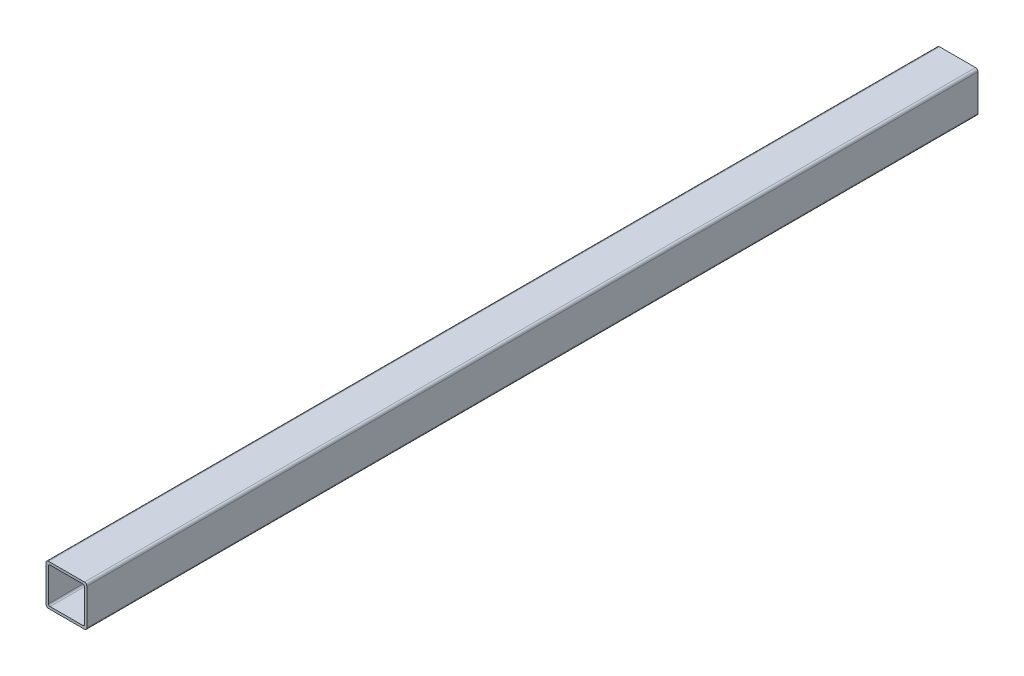
ISO-10303-21;
HEADER;
FILE_DESCRIPTION(('STEP AP214'),'2;1');
FILE_NAME('part.step','',(''),(''),'','','');
FILE_SCHEMA(('AUTOMOTIVE_DESIGN { 1 0 10303 214 1 1 1 1 }'));
ENDSEC;
DATA;
#1=APPLICATION_CONTEXT('core data for automotive mechanical design processes');
#2=APPLICATION_PROTOCOL_DEFINITION('international standard','automotive_design',2000,#1);
#3=PRODUCT_CONTEXT('',#1,'mechanical');
#4=PRODUCT('Part','Part','',(#3));
#5=PRODUCT_RELATED_PRODUCT_CATEGORY('part','',(#4));
#6=PRODUCT_DEFINITION_FORMATION('','',#4);
#7=PRODUCT_DEFINITION_CONTEXT('part definition',#1,'design');
#8=PRODUCT_DEFINITION('design','',#6,#7);
#9=PRODUCT_DEFINITION_SHAPE('','',#8);
#10=(LENGTH_UNIT() NAMED_UNIT(*) SI_UNIT(.MILLI.,.METRE.));
#11=(NAMED_UNIT(*) PLANE_ANGLE_UNIT() SI_UNIT($,.RADIAN.));
#12=(NAMED_UNIT(*) SI_UNIT($,.STERADIAN.) SOLID_ANGLE_UNIT());
#13=UNCERTAINTY_MEASURE_WITH_UNIT(LENGTH_MEASURE(1.E-05),#10,'distance_accuracy_value','');
#14=(GEOMETRIC_REPRESENTATION_CONTEXT(3) GLOBAL_UNCERTAINTY_ASSIGNED_CONTEXT((#13)) GLOBAL_UNIT_ASSIGNED_CONTEXT((#10,
#11,#12)) REPRESENTATION_CONTEXT('',''));
#15=CARTESIAN_POINT('',(0.,0.,0.));
#16=DIRECTION('',(0.,0.,1.));
#17=DIRECTION('',(1.,0.,0.));
#18=AXIS2_PLACEMENT_3D('',#15,#16,#17);
#19=CARTESIAN_POINT('',(-22.,-25.,-1160.71067811867));
#20=DIRECTION('',(0.,-1.,0.));
#21=DIRECTION('',(0.,0.,-1.));
#22=AXIS2_PLACEMENT_3D('',#19,#20,#21);
#23=PLANE('',#22);
#24=DIRECTION('',(-1.,0.,0.));
#25=VECTOR('',#24,1.);
#26=CARTESIAN_POINT('',(-22.,-25.,-1090.00000000001));
#27=LINE('',#26,#25);
#28=CARTESIAN_POINT('',(22.,-25.,-1090.00000000001));
#29=VERTEX_POINT('',#28);
#30=CARTESIAN_POINT('',(-22.,-25.,-1090.00000000001));
#31=VERTEX_POINT('',#30);
#32=EDGE_CURVE('E11',#29,#31,#27,.T.);
#33=ORIENTED_EDGE('',*,*,#32,.F.);
#34=DIRECTION('',(0.,0.,1.));
#35=VECTOR('',#34,1.);
#36=CARTESIAN_POINT('',(22.,-25.,-1160.71067811867));
#37=LINE('',#36,#35);
#38=CARTESIAN_POINT('',(22.,-25.,0.));
#39=VERTEX_POINT('',#38);
#40=EDGE_CURVE('E266',#29,#39,#37,.T.);
#41=ORIENTED_EDGE('',*,*,#40,.T.);
#42=DIRECTION('',(1.,0.,0.));
#43=VECTOR('',#42,1.);
#44=CARTESIAN_POINT('',(-22.,-25.,0.));
#45=LINE('',#44,#43);
#46=CARTESIAN_POINT('',(-22.,-25.,0.));
#47=VERTEX_POINT('',#46);
#48=EDGE_CURVE('E219',#47,#39,#45,.T.);
#49=ORIENTED_EDGE('',*,*,#48,.F.);
#50=DIRECTION('',(0.,0.,1.));
#51=VECTOR('',#50,1.);
#52=CARTESIAN_POINT('',(-22.,-25.,-1160.71067811867));
#53=LINE('',#52,#51);
#54=EDGE_CURVE('E247',#31,#47,#53,.T.);
#55=ORIENTED_EDGE('',*,*,#54,.F.);
#56=EDGE_LOOP('',(#33,#41,#49,#55));
#57=FACE_BOUND('',#56,.T.);
#58=ADVANCED_FACE('F36',(#57),#23,.T.);
#59=CARTESIAN_POINT('',(22.,-22.,-1160.71067811867));
#60=DIRECTION('',(0.,0.,1.));
#61=DIRECTION('',(1.,0.,0.));
#62=AXIS2_PLACEMENT_3D('',#59,#60,#61);
#63=CYLINDRICAL_SURFACE('',#62,3.);
#64=CARTESIAN_POINT('',(22.,-22.,-1090.00000000001));
#65=DIRECTION('',(0.,0.,1.));
#66=DIRECTION('',(1.,0.,0.));
#67=AXIS2_PLACEMENT_3D('',#64,#65,#66);
#68=CIRCLE('',#67,3.);
#69=CARTESIAN_POINT('',(25.,-22.,-1090.00000000001));
#70=VERTEX_POINT('',#69);
#71=EDGE_CURVE('E350',#70,#29,#68,.F.);
#72=ORIENTED_EDGE('',*,*,#71,.F.);
#73=DIRECTION('',(0.,0.,1.));
#74=VECTOR('',#73,1.);
#75=CARTESIAN_POINT('',(25.,-22.,-1160.71067811867));
#76=LINE('',#75,#74);
#77=CARTESIAN_POINT('',(25.,-22.,0.));
#78=VERTEX_POINT('',#77);
#79=EDGE_CURVE('E263',#70,#78,#76,.T.);
#80=ORIENTED_EDGE('',*,*,#79,.T.);
#81=CARTESIAN_POINT('',(22.,-22.,0.));
#82=DIRECTION('',(0.,0.,1.));
#83=DIRECTION('',(1.,0.,0.));
#84=AXIS2_PLACEMENT_3D('',#81,#82,#83);
#85=CIRCLE('',#84,3.);
#86=EDGE_CURVE('E223',#39,#78,#85,.T.);
#87=ORIENTED_EDGE('',*,*,#86,.F.);
#88=ORIENTED_EDGE('',*,*,#40,.F.);
#89=EDGE_LOOP('',(#72,#80,#87,#88));
#90=FACE_BOUND('',#89,.T.);
#91=ADVANCED_FACE('F379',(#90),#63,.T.);
#92=CARTESIAN_POINT('',(25.,22.,-1160.71067811867));
#93=DIRECTION('',(1.,0.,0.));
#94=DIRECTION('',(0.,0.,-1.));
#95=AXIS2_PLACEMENT_3D('',#92,#93,#94);
#96=PLANE('',#95);
#97=DIRECTION('',(0.,-1.,0.));
#98=VECTOR('',#97,1.);
#99=CARTESIAN_POINT('',(25.,22.,-1090.00000000001));
#100=LINE('',#99,#98);
#101=CARTESIAN_POINT('',(25.,22.,-1090.00000000001));
#102=VERTEX_POINT('',#101);
#103=EDGE_CURVE('E353',#102,#70,#100,.T.);
#104=ORIENTED_EDGE('',*,*,#103,.F.);
#105=DIRECTION('',(0.,0.,1.));
#106=VECTOR('',#105,1.);
#107=CARTESIAN_POINT('',(25.,22.,-1160.71067811867));
#108=LINE('',#107,#106);
#109=CARTESIAN_POINT('',(25.,22.,0.));
#110=VERTEX_POINT('',#109);
#111=EDGE_CURVE('E260',#102,#110,#108,.T.);
#112=ORIENTED_EDGE('',*,*,#111,.T.);
#113=DIRECTION('',(0.,1.,0.));
#114=VECTOR('',#113,1.);
#115=CARTESIAN_POINT('',(25.,22.,0.));
#116=LINE('',#115,#114);
#117=EDGE_CURVE('E227',#78,#110,#116,.T.);
#118=ORIENTED_EDGE('',*,*,#117,.F.);
#119=ORIENTED_EDGE('',*,*,#79,.F.);
#120=EDGE_LOOP('',(#104,#112,#118,#119));
#121=FACE_BOUND('',#120,.T.);
#122=ADVANCED_FACE('F376',(#121),#96,.T.);
#123=CARTESIAN_POINT('',(22.,22.,-1160.71067811867));
#124=DIRECTION('',(0.,0.,1.));
#125=DIRECTION('',(1.,0.,0.));
#126=AXIS2_PLACEMENT_3D('',#123,#124,#125);
#127=CYLINDRICAL_SURFACE('',#126,3.00000000000001);
#128=CARTESIAN_POINT('',(22.,22.,-1090.00000000001));
#129=DIRECTION('',(0.,0.,1.));
#130=DIRECTION('',(1.,0.,0.));
#131=AXIS2_PLACEMENT_3D('',#128,#129,#130);
#132=CIRCLE('',#131,3.00000000000001);
#133=CARTESIAN_POINT('',(22.,25.,-1090.00000000001));
#134=VERTEX_POINT('',#133);
#135=EDGE_CURVE('E356',#134,#102,#132,.F.);
#136=ORIENTED_EDGE('',*,*,#135,.F.);
#137=DIRECTION('',(0.,0.,1.));
#138=VECTOR('',#137,1.);
#139=CARTESIAN_POINT('',(22.,25.,-1160.71067811867));
#140=LINE('',#139,#138);
#141=CARTESIAN_POINT('',(22.,25.,0.));
#142=VERTEX_POINT('',#141);
#143=EDGE_CURVE('E257',#134,#142,#140,.T.);
#144=ORIENTED_EDGE('',*,*,#143,.T.);
#145=CARTESIAN_POINT('',(22.,22.,0.));
#146=DIRECTION('',(0.,0.,1.));
#147=DIRECTION('',(-1.,0.,0.));
#148=AXIS2_PLACEMENT_3D('',#145,#146,#147);
#149=CIRCLE('',#148,3.00000000000001);
#150=EDGE_CURVE('E231',#110,#142,#149,.T.);
#151=ORIENTED_EDGE('',*,*,#150,.F.);
#152=ORIENTED_EDGE('',*,*,#111,.F.);
#153=EDGE_LOOP('',(#136,#144,#151,#152));
#154=FACE_BOUND('',#153,.T.);
#155=ADVANCED_FACE('F369',(#154),#127,.T.);
#156=CARTESIAN_POINT('',(-22.,25.,-1160.71067811867));
#157=DIRECTION('',(0.,1.,0.));
#158=DIRECTION('',(-1.,0.,0.));
#159=AXIS2_PLACEMENT_3D('',#156,#157,#158);
#160=PLANE('',#159);
#161=DIRECTION('',(1.,0.,0.));
#162=VECTOR('',#161,1.);
#163=CARTESIAN_POINT('',(-22.,25.,-1090.00000000001));
#164=LINE('',#163,#162);
#165=CARTESIAN_POINT('',(-22.,25.,-1090.00000000001));
#166=VERTEX_POINT('',#165);
#167=EDGE_CURVE('E298',#166,#134,#164,.T.);
#168=ORIENTED_EDGE('',*,*,#167,.F.);
#169=DIRECTION('',(0.,0.,1.));
#170=VECTOR('',#169,1.);
#171=CARTESIAN_POINT('',(-22.,25.,-1160.71067811867));
#172=LINE('',#171,#170);
#173=CARTESIAN_POINT('',(-22.,25.,0.));
#174=VERTEX_POINT('',#173);
#175=EDGE_CURVE('E254',#166,#174,#172,.T.);
#176=ORIENTED_EDGE('',*,*,#175,.T.);
#177=DIRECTION('',(-1.,0.,0.));
#178=VECTOR('',#177,1.);
#179=CARTESIAN_POINT('',(-22.,25.,0.));
#180=LINE('',#179,#178);
#181=EDGE_CURVE('E235',#142,#174,#180,.T.);
#182=ORIENTED_EDGE('',*,*,#181,.F.);
#183=ORIENTED_EDGE('',*,*,#143,.F.);
#184=EDGE_LOOP('',(#168,#176,#182,#183));
#185=FACE_BOUND('',#184,.T.);
#186=ADVANCED_FACE('F372',(#185),#160,.T.);
#187=CARTESIAN_POINT('',(-22.,22.,-1160.71067811867));
#188=DIRECTION('',(0.,0.,1.));
#189=DIRECTION('',(1.,0.,0.));
#190=AXIS2_PLACEMENT_3D('',#187,#188,#189);
#191=CYLINDRICAL_SURFACE('',#190,3.);
#192=CARTESIAN_POINT('',(-22.,22.,-1090.00000000001));
#193=DIRECTION('',(0.,0.,1.));
#194=DIRECTION('',(1.,0.,0.));
#195=AXIS2_PLACEMENT_3D('',#192,#193,#194);
#196=CIRCLE('',#195,3.);
#197=CARTESIAN_POINT('',(-25.,22.,-1090.00000000001));
#198=VERTEX_POINT('',#197);
#199=EDGE_CURVE('E291',#198,#166,#196,.F.);
#200=ORIENTED_EDGE('',*,*,#199,.F.);
#201=DIRECTION('',(0.,0.,1.));
#202=VECTOR('',#201,1.);
#203=CARTESIAN_POINT('',(-25.,22.,-1160.71067811867));
#204=LINE('',#203,#202);
#205=CARTESIAN_POINT('',(-25.,22.,0.));
#206=VERTEX_POINT('',#205);
#207=EDGE_CURVE('E251',#198,#206,#204,.T.);
#208=ORIENTED_EDGE('',*,*,#207,.T.);
#209=CARTESIAN_POINT('',(-22.,22.,0.));
#210=DIRECTION('',(0.,0.,1.));
#211=DIRECTION('',(1.,0.,0.));
#212=AXIS2_PLACEMENT_3D('',#209,#210,#211);
#213=CIRCLE('',#212,3.);
#214=EDGE_CURVE('E239',#174,#206,#213,.T.);
#215=ORIENTED_EDGE('',*,*,#214,.F.);
#216=ORIENTED_EDGE('',*,*,#175,.F.);
#217=EDGE_LOOP('',(#200,#208,#215,#216));
#218=FACE_BOUND('',#217,.T.);
#219=ADVANCED_FACE('F392',(#218),#191,.T.);
#220=CARTESIAN_POINT('',(-25.,22.,-1160.71067811867));
#221=DIRECTION('',(-1.,0.,0.));
#222=DIRECTION('',(0.,0.,1.));
#223=AXIS2_PLACEMENT_3D('',#220,#221,#222);
#224=PLANE('',#223);
#225=DIRECTION('',(0.,1.,0.));
#226=VECTOR('',#225,1.);
#227=CARTESIAN_POINT('',(-25.,22.,-1090.00000000001));
#228=LINE('',#227,#226);
#229=CARTESIAN_POINT('',(-25.,-22.,-1090.00000000001));
#230=VERTEX_POINT('',#229);
#231=EDGE_CURVE('E287',#230,#198,#228,.T.);
#232=ORIENTED_EDGE('',*,*,#231,.F.);
#233=DIRECTION('',(0.,0.,1.));
#234=VECTOR('',#233,1.);
#235=CARTESIAN_POINT('',(-25.,-22.,-1160.71067811867));
#236=LINE('',#235,#234);
#237=CARTESIAN_POINT('',(-25.,-22.,0.));
#238=VERTEX_POINT('',#237);
#239=EDGE_CURVE('E248',#230,#238,#236,.T.);
#240=ORIENTED_EDGE('',*,*,#239,.T.);
#241=DIRECTION('',(0.,-1.,0.));
#242=VECTOR('',#241,1.);
#243=CARTESIAN_POINT('',(-25.,22.,0.));
#244=LINE('',#243,#242);
#245=EDGE_CURVE('E243',#206,#238,#244,.T.);
#246=ORIENTED_EDGE('',*,*,#245,.F.);
#247=ORIENTED_EDGE('',*,*,#207,.F.);
#248=EDGE_LOOP('',(#232,#240,#246,#247));
#249=FACE_BOUND('',#248,.T.);
#250=ADVANCED_FACE('F286',(#249),#224,.T.);
#251=CARTESIAN_POINT('',(-22.,-22.,-1160.71067811867));
#252=DIRECTION('',(0.,0.,1.));
#253=DIRECTION('',(1.,0.,0.));
#254=AXIS2_PLACEMENT_3D('',#251,#252,#253);
#255=CYLINDRICAL_SURFACE('',#254,3.);
#256=CARTESIAN_POINT('',(-22.,-22.,-1090.00000000001));
#257=DIRECTION('',(0.,0.,1.));
#258=DIRECTION('',(1.,0.,0.));
#259=AXIS2_PLACEMENT_3D('',#256,#257,#258);
#260=CIRCLE('',#259,3.);
#261=EDGE_CURVE('E276',#31,#230,#260,.F.);
#262=ORIENTED_EDGE('',*,*,#261,.F.);
#263=ORIENTED_EDGE('',*,*,#54,.T.);
#264=CARTESIAN_POINT('',(-22.,-22.,0.));
#265=DIRECTION('',(0.,0.,1.));
#266=DIRECTION('',(1.,0.,0.));
#267=AXIS2_PLACEMENT_3D('',#264,#265,#266);
#268=CIRCLE('',#267,3.);
#269=EDGE_CURVE('E199',#238,#47,#268,.T.);
#270=ORIENTED_EDGE('',*,*,#269,.F.);
#271=ORIENTED_EDGE('',*,*,#239,.F.);
#272=EDGE_LOOP('',(#262,#263,#270,#271));
#273=FACE_BOUND('',#272,.T.);
#274=ADVANCED_FACE('F38',(#273),#255,.T.);
#275=CARTESIAN_POINT('',(-22.,-22.,0.));
#276=DIRECTION('',(0.,0.,1.));
#277=DIRECTION('',(1.,0.,0.));
#278=AXIS2_PLACEMENT_3D('',#275,#276,#277);
#279=PLANE('',#278);
#280=CARTESIAN_POINT('',(-20.,-20.,0.));
#281=DIRECTION('',(0.,0.,1.));
#282=DIRECTION('',(1.,0.,0.));
#283=AXIS2_PLACEMENT_3D('',#280,#281,#282);
#284=CIRCLE('',#283,2.);
#285=CARTESIAN_POINT('',(-22.,-20.,0.));
#286=VERTEX_POINT('',#285);
#287=CARTESIAN_POINT('',(-20.,-22.,0.));
#288=VERTEX_POINT('',#287);
#289=EDGE_CURVE('E166',#286,#288,#284,.T.);
#290=ORIENTED_EDGE('',*,*,#289,.F.);
#291=DIRECTION('',(0.,-1.,0.));
#292=VECTOR('',#291,1.);
#293=CARTESIAN_POINT('',(-22.,20.,0.));
#294=LINE('',#293,#292);
#295=CARTESIAN_POINT('',(-22.,20.,0.));
#296=VERTEX_POINT('',#295);
#297=EDGE_CURVE('E192',#296,#286,#294,.T.);
#298=ORIENTED_EDGE('',*,*,#297,.F.);
#299=CARTESIAN_POINT('',(-20.,20.,0.));
#300=DIRECTION('',(0.,0.,1.));
#301=DIRECTION('',(1.,0.,0.));
#302=AXIS2_PLACEMENT_3D('',#299,#300,#301);
#303=CIRCLE('',#302,2.);
#304=CARTESIAN_POINT('',(-20.,22.,0.));
#305=VERTEX_POINT('',#304);
#306=EDGE_CURVE('E188',#305,#296,#303,.T.);
#307=ORIENTED_EDGE('',*,*,#306,.F.);
#308=DIRECTION('',(-1.,0.,0.));
#309=VECTOR('',#308,1.);
#310=CARTESIAN_POINT('',(-20.,22.,0.));
#311=LINE('',#310,#309);
#312=CARTESIAN_POINT('',(20.,22.,0.));
#313=VERTEX_POINT('',#312);
#314=EDGE_CURVE('E184',#313,#305,#311,.T.);
#315=ORIENTED_EDGE('',*,*,#314,.F.);
#316=CARTESIAN_POINT('',(20.,20.,0.));
#317=DIRECTION('',(0.,0.,1.));
#318=DIRECTION('',(-1.,0.,0.));
#319=AXIS2_PLACEMENT_3D('',#316,#317,#318);
#320=CIRCLE('',#319,2.);
#321=CARTESIAN_POINT('',(22.,20.,0.));
#322=VERTEX_POINT('',#321);
#323=EDGE_CURVE('E177',#322,#313,#320,.T.);
#324=ORIENTED_EDGE('',*,*,#323,.F.);
#325=DIRECTION('',(0.,1.,0.));
#326=VECTOR('',#325,1.);
#327=CARTESIAN_POINT('',(22.,20.,0.));
#328=LINE('',#327,#326);
#329=CARTESIAN_POINT('',(22.,-20.,0.));
#330=VERTEX_POINT('',#329);
#331=EDGE_CURVE('E172',#330,#322,#328,.T.);
#332=ORIENTED_EDGE('',*,*,#331,.F.);
#333=CARTESIAN_POINT('',(20.,-20.,0.));
#334=DIRECTION('',(0.,0.,1.));
#335=DIRECTION('',(1.,0.,0.));
#336=AXIS2_PLACEMENT_3D('',#333,#334,#335);
#337=CIRCLE('',#336,2.);
#338=CARTESIAN_POINT('',(20.,-22.,0.));
#339=VERTEX_POINT('',#338);
#340=EDGE_CURVE('E151',#339,#330,#337,.T.);
#341=ORIENTED_EDGE('',*,*,#340,.F.);
#342=DIRECTION('',(1.,0.,0.));
#343=VECTOR('',#342,1.);
#344=CARTESIAN_POINT('',(-20.,-22.,0.));
#345=LINE('',#344,#343);
#346=EDGE_CURVE('E159',#288,#339,#345,.T.);
#347=ORIENTED_EDGE('',*,*,#346,.F.);
#348=EDGE_LOOP('',(#290,#298,#307,#315,#324,#332,#341,#347));
#349=FACE_BOUND('',#348,.T.);
#350=ORIENTED_EDGE('',*,*,#269,.T.);
#351=ORIENTED_EDGE('',*,*,#48,.T.);
#352=ORIENTED_EDGE('',*,*,#86,.T.);
#353=ORIENTED_EDGE('',*,*,#117,.T.);
#354=ORIENTED_EDGE('',*,*,#150,.T.);
#355=ORIENTED_EDGE('',*,*,#181,.T.);
#356=ORIENTED_EDGE('',*,*,#214,.T.);
#357=ORIENTED_EDGE('',*,*,#245,.T.);
#358=EDGE_LOOP('',(#350,#351,#352,#353,#354,#355,#356,#357));
#359=FACE_BOUND('',#358,.T.);
#360=ADVANCED_FACE('F168',(#349,#359),#279,.T.);
#361=CARTESIAN_POINT('',(-20.,-22.,-1160.71067811867));
#362=DIRECTION('',(0.,-1.,0.));
#363=DIRECTION('',(0.,0.,-1.));
#364=AXIS2_PLACEMENT_3D('',#361,#362,#363);
#365=PLANE('',#364);
#366=DIRECTION('',(0.,0.,1.));
#367=VECTOR('',#366,1.);
#368=CARTESIAN_POINT('',(20.,-22.,-1160.71067811867));
#369=LINE('',#368,#367);
#370=CARTESIAN_POINT('',(20.,-22.,-1090.00000000001));
#371=VERTEX_POINT('',#370);
#372=EDGE_CURVE('E147',#371,#339,#369,.T.);
#373=ORIENTED_EDGE('',*,*,#372,.F.);
#374=DIRECTION('',(-1.,0.,0.));
#375=VECTOR('',#374,1.);
#376=CARTESIAN_POINT('',(-20.,-22.,-1090.00000000001));
#377=LINE('',#376,#375);
#378=CARTESIAN_POINT('',(-20.,-22.,-1090.00000000001));
#379=VERTEX_POINT('',#378);
#380=EDGE_CURVE('E40',#371,#379,#377,.T.);
#381=ORIENTED_EDGE('',*,*,#380,.T.);
#382=DIRECTION('',(0.,0.,1.));
#383=VECTOR('',#382,1.);
#384=CARTESIAN_POINT('',(-20.,-22.,-1160.71067811867));
#385=LINE('',#384,#383);
#386=EDGE_CURVE('E156',#379,#288,#385,.T.);
#387=ORIENTED_EDGE('',*,*,#386,.T.);
#388=ORIENTED_EDGE('',*,*,#346,.T.);
#389=EDGE_LOOP('',(#373,#381,#387,#388));
#390=FACE_BOUND('',#389,.T.);
#391=ADVANCED_FACE('F160',(#390),#365,.F.);
#392=CARTESIAN_POINT('',(20.,-20.,-1160.71067811867));
#393=DIRECTION('',(0.,0.,1.));
#394=DIRECTION('',(1.,0.,0.));
#395=AXIS2_PLACEMENT_3D('',#392,#393,#394);
#396=CYLINDRICAL_SURFACE('',#395,2.);
#397=DIRECTION('',(0.,0.,1.));
#398=VECTOR('',#397,1.);
#399=CARTESIAN_POINT('',(22.,-20.,-1160.71067811867));
#400=LINE('',#399,#398);
#401=CARTESIAN_POINT('',(22.,-20.,-1090.00000000001));
#402=VERTEX_POINT('',#401);
#403=EDGE_CURVE('E155',#402,#330,#400,.T.);
#404=ORIENTED_EDGE('',*,*,#403,.F.);
#405=CARTESIAN_POINT('',(20.,-20.,-1090.00000000001));
#406=DIRECTION('',(0.,0.,1.));
#407=DIRECTION('',(1.,0.,0.));
#408=AXIS2_PLACEMENT_3D('',#405,#406,#407);
#409=CIRCLE('',#408,2.);
#410=EDGE_CURVE('E46',#402,#371,#409,.F.);
#411=ORIENTED_EDGE('',*,*,#410,.T.);
#412=ORIENTED_EDGE('',*,*,#372,.T.);
#413=ORIENTED_EDGE('',*,*,#340,.T.);
#414=EDGE_LOOP('',(#404,#411,#412,#413));
#415=FACE_BOUND('',#414,.T.);
#416=ADVANCED_FACE('F149',(#415),#396,.F.);
#417=CARTESIAN_POINT('',(22.,20.,-1160.71067811867));
#418=DIRECTION('',(1.,0.,0.));
#419=DIRECTION('',(0.,0.,-1.));
#420=AXIS2_PLACEMENT_3D('',#417,#418,#419);
#421=PLANE('',#420);
#422=DIRECTION('',(0.,0.,1.));
#423=VECTOR('',#422,1.);
#424=CARTESIAN_POINT('',(22.,20.,-1160.71067811867));
#425=LINE('',#424,#423);
#426=CARTESIAN_POINT('',(22.,20.,-1090.00000000001));
#427=VERTEX_POINT('',#426);
#428=EDGE_CURVE('E209',#427,#322,#425,.T.);
#429=ORIENTED_EDGE('',*,*,#428,.F.);
#430=DIRECTION('',(0.,-1.,0.));
#431=VECTOR('',#430,1.);
#432=CARTESIAN_POINT('',(22.,20.,-1090.00000000001));
#433=LINE('',#432,#431);
#434=EDGE_CURVE('E332',#427,#402,#433,.T.);
#435=ORIENTED_EDGE('',*,*,#434,.T.);
#436=ORIENTED_EDGE('',*,*,#403,.T.);
#437=ORIENTED_EDGE('',*,*,#331,.T.);
#438=EDGE_LOOP('',(#429,#435,#436,#437));
#439=FACE_BOUND('',#438,.T.);
#440=ADVANCED_FACE('F331',(#439),#421,.F.);
#441=CARTESIAN_POINT('',(20.,20.,-1160.71067811867));
#442=DIRECTION('',(0.,0.,1.));
#443=DIRECTION('',(1.,0.,0.));
#444=AXIS2_PLACEMENT_3D('',#441,#442,#443);
#445=CYLINDRICAL_SURFACE('',#444,2.);
#446=DIRECTION('',(0.,0.,1.));
#447=VECTOR('',#446,1.);
#448=CARTESIAN_POINT('',(20.,22.,-1160.71067811867));
#449=LINE('',#448,#447);
#450=CARTESIAN_POINT('',(20.,22.,-1090.00000000001));
#451=VERTEX_POINT('',#450);
#452=EDGE_CURVE('E206',#451,#313,#449,.T.);
#453=ORIENTED_EDGE('',*,*,#452,.F.);
#454=CARTESIAN_POINT('',(20.,20.,-1090.00000000001));
#455=DIRECTION('',(0.,0.,1.));
#456=DIRECTION('',(1.,0.,0.));
#457=AXIS2_PLACEMENT_3D('',#454,#455,#456);
#458=CIRCLE('',#457,2.);
#459=EDGE_CURVE('E328',#451,#427,#458,.F.);
#460=ORIENTED_EDGE('',*,*,#459,.T.);
#461=ORIENTED_EDGE('',*,*,#428,.T.);
#462=ORIENTED_EDGE('',*,*,#323,.T.);
#463=EDGE_LOOP('',(#453,#460,#461,#462));
#464=FACE_BOUND('',#463,.T.);
#465=ADVANCED_FACE('F325',(#464),#445,.F.);
#466=CARTESIAN_POINT('',(-20.,22.,-1160.71067811867));
#467=DIRECTION('',(0.,1.,0.));
#468=DIRECTION('',(0.,0.,1.));
#469=AXIS2_PLACEMENT_3D('',#466,#467,#468);
#470=PLANE('',#469);
#471=DIRECTION('',(0.,0.,1.));
#472=VECTOR('',#471,1.);
#473=CARTESIAN_POINT('',(-20.,22.,-1160.71067811867));
#474=LINE('',#473,#472);
#475=CARTESIAN_POINT('',(-20.,22.,-1090.00000000001));
#476=VERTEX_POINT('',#475);
#477=EDGE_CURVE('E203',#476,#305,#474,.T.);
#478=ORIENTED_EDGE('',*,*,#477,.F.);
#479=DIRECTION('',(1.,0.,0.));
#480=VECTOR('',#479,1.);
#481=CARTESIAN_POINT('',(-20.,22.,-1090.00000000001));
#482=LINE('',#481,#480);
#483=EDGE_CURVE('E339',#476,#451,#482,.T.);
#484=ORIENTED_EDGE('',*,*,#483,.T.);
#485=ORIENTED_EDGE('',*,*,#452,.T.);
#486=ORIENTED_EDGE('',*,*,#314,.T.);
#487=EDGE_LOOP('',(#478,#484,#485,#486));
#488=FACE_BOUND('',#487,.T.);
#489=ADVANCED_FACE('F322',(#488),#470,.F.);
#490=CARTESIAN_POINT('',(-20.,20.,-1160.71067811867));
#491=DIRECTION('',(0.,0.,1.));
#492=DIRECTION('',(1.,0.,0.));
#493=AXIS2_PLACEMENT_3D('',#490,#491,#492);
#494=CYLINDRICAL_SURFACE('',#493,2.);
#495=DIRECTION('',(0.,0.,1.));
#496=VECTOR('',#495,1.);
#497=CARTESIAN_POINT('',(-22.,20.,-1160.71067811867));
#498=LINE('',#497,#496);
#499=CARTESIAN_POINT('',(-22.,20.,-1090.00000000001));
#500=VERTEX_POINT('',#499);
#501=EDGE_CURVE('E200',#500,#296,#498,.T.);
#502=ORIENTED_EDGE('',*,*,#501,.F.);
#503=CARTESIAN_POINT('',(-20.,20.,-1090.00000000001));
#504=DIRECTION('',(0.,0.,1.));
#505=DIRECTION('',(1.,0.,0.));
#506=AXIS2_PLACEMENT_3D('',#503,#504,#505);
#507=CIRCLE('',#506,2.);
#508=EDGE_CURVE('E319',#500,#476,#507,.F.);
#509=ORIENTED_EDGE('',*,*,#508,.T.);
#510=ORIENTED_EDGE('',*,*,#477,.T.);
#511=ORIENTED_EDGE('',*,*,#306,.T.);
#512=EDGE_LOOP('',(#502,#509,#510,#511));
#513=FACE_BOUND('',#512,.T.);
#514=ADVANCED_FACE('F317',(#513),#494,.F.);
#515=CARTESIAN_POINT('',(-22.,20.,-1160.71067811867));
#516=DIRECTION('',(-1.,0.,0.));
#517=DIRECTION('',(0.,0.,1.));
#518=AXIS2_PLACEMENT_3D('',#515,#516,#517);
#519=PLANE('',#518);
#520=DIRECTION('',(0.,0.,1.));
#521=VECTOR('',#520,1.);
#522=CARTESIAN_POINT('',(-22.,-20.,-1160.71067811867));
#523=LINE('',#522,#521);
#524=CARTESIAN_POINT('',(-22.,-20.,-1090.00000000001));
#525=VERTEX_POINT('',#524);
#526=EDGE_CURVE('E196',#525,#286,#523,.T.);
#527=ORIENTED_EDGE('',*,*,#526,.F.);
#528=DIRECTION('',(0.,1.,0.));
#529=VECTOR('',#528,1.);
#530=CARTESIAN_POINT('',(-22.,20.,-1090.00000000001));
#531=LINE('',#530,#529);
#532=EDGE_CURVE('E314',#525,#500,#531,.T.);
#533=ORIENTED_EDGE('',*,*,#532,.T.);
#534=ORIENTED_EDGE('',*,*,#501,.T.);
#535=ORIENTED_EDGE('',*,*,#297,.T.);
#536=EDGE_LOOP('',(#527,#533,#534,#535));
#537=FACE_BOUND('',#536,.T.);
#538=ADVANCED_FACE('F311',(#537),#519,.F.);
#539=CARTESIAN_POINT('',(-20.,-20.,-1160.71067811867));
#540=DIRECTION('',(0.,0.,1.));
#541=DIRECTION('',(1.,0.,0.));
#542=AXIS2_PLACEMENT_3D('',#539,#540,#541);
#543=CYLINDRICAL_SURFACE('',#542,2.);
#544=ORIENTED_EDGE('',*,*,#386,.F.);
#545=CARTESIAN_POINT('',(-20.,-20.,-1090.00000000001));
#546=DIRECTION('',(0.,0.,1.));
#547=DIRECTION('',(1.,0.,0.));
#548=AXIS2_PLACEMENT_3D('',#545,#546,#547);
#549=CIRCLE('',#548,2.);
#550=EDGE_CURVE('E296',#379,#525,#549,.F.);
#551=ORIENTED_EDGE('',*,*,#550,.T.);
#552=ORIENTED_EDGE('',*,*,#526,.T.);
#553=ORIENTED_EDGE('',*,*,#289,.T.);
#554=EDGE_LOOP('',(#544,#551,#552,#553));
#555=FACE_BOUND('',#554,.T.);
#556=ADVANCED_FACE('F304',(#555),#543,.F.);
#557=CARTESIAN_POINT('',(22.,-300.,-1090.00000000001));
#558=DIRECTION('',(0.,0.,1.));
#559=DIRECTION('',(1.,0.,0.));
#560=AXIS2_PLACEMENT_3D('',#557,#558,#559);
#561=PLANE('',#560);
#562=ORIENTED_EDGE('',*,*,#261,.T.);
#563=ORIENTED_EDGE('',*,*,#231,.T.);
#564=ORIENTED_EDGE('',*,*,#199,.T.);
#565=ORIENTED_EDGE('',*,*,#167,.T.);
#566=ORIENTED_EDGE('',*,*,#135,.T.);
#567=ORIENTED_EDGE('',*,*,#103,.T.);
#568=ORIENTED_EDGE('',*,*,#71,.T.);
#569=ORIENTED_EDGE('',*,*,#32,.T.);
#570=EDGE_LOOP('',(#562,#563,#564,#565,#566,#567,#568,#569));
#571=FACE_BOUND('',#570,.T.);
#572=ORIENTED_EDGE('',*,*,#380,.F.);
#573=ORIENTED_EDGE('',*,*,#410,.F.);
#574=ORIENTED_EDGE('',*,*,#434,.F.);
#575=ORIENTED_EDGE('',*,*,#459,.F.);
#576=ORIENTED_EDGE('',*,*,#483,.F.);
#577=ORIENTED_EDGE('',*,*,#508,.F.);
#578=ORIENTED_EDGE('',*,*,#532,.F.);
#579=ORIENTED_EDGE('',*,*,#550,.F.);
#580=EDGE_LOOP('',(#572,#573,#574,#575,#576,#577,#578,#579));
#581=FACE_BOUND('',#580,.T.);
#582=ADVANCED_FACE('F362',(#571,#581),#561,.F.);
#583=CLOSED_SHELL('',(#58,#91,#122,#155,#186,#219,#250,#274,#360,#391,#416,#440,#465,#489,#514,
#538,#556,#582));
#584=MANIFOLD_SOLID_BREP('B2',#583);
#585=ADVANCED_BREP_SHAPE_REPRESENTATION('',(#18,#584),#14);
#586=SHAPE_DEFINITION_REPRESENTATION(#9,#585);
ENDSEC;
END-ISO-10303-21;
